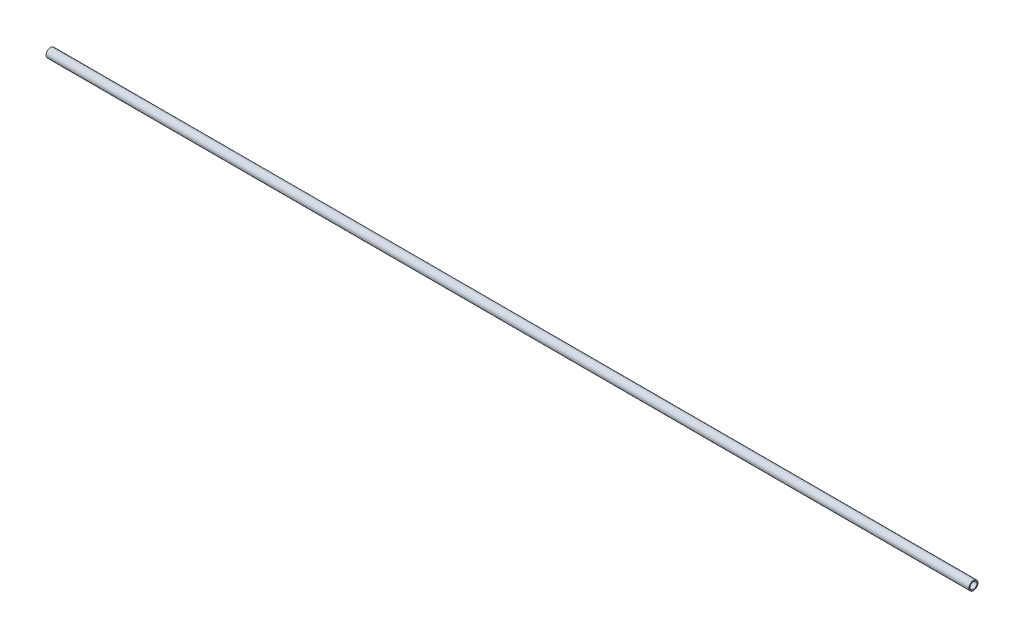
ISO-10303-21;
HEADER;
FILE_DESCRIPTION(('STEP AP214'),'2;1');
FILE_NAME('part.step','',(''),(''),'','','');
FILE_SCHEMA(('AUTOMOTIVE_DESIGN { 1 0 10303 214 1 1 1 1 }'));
ENDSEC;
DATA;
#1=APPLICATION_CONTEXT('core data for automotive mechanical design processes');
#2=APPLICATION_PROTOCOL_DEFINITION('international standard','automotive_design',2000,#1);
#3=PRODUCT_CONTEXT('',#1,'mechanical');
#4=PRODUCT('Part','Part','',(#3));
#5=PRODUCT_RELATED_PRODUCT_CATEGORY('part','',(#4));
#6=PRODUCT_DEFINITION_FORMATION('','',#4);
#7=PRODUCT_DEFINITION_CONTEXT('part definition',#1,'design');
#8=PRODUCT_DEFINITION('design','',#6,#7);
#9=PRODUCT_DEFINITION_SHAPE('','',#8);
#10=(LENGTH_UNIT() NAMED_UNIT(*) SI_UNIT(.MILLI.,.METRE.));
#11=(NAMED_UNIT(*) PLANE_ANGLE_UNIT() SI_UNIT($,.RADIAN.));
#12=(NAMED_UNIT(*) SI_UNIT($,.STERADIAN.) SOLID_ANGLE_UNIT());
#13=UNCERTAINTY_MEASURE_WITH_UNIT(LENGTH_MEASURE(1.E-05),#10,'distance_accuracy_value','');
#14=(GEOMETRIC_REPRESENTATION_CONTEXT(3) GLOBAL_UNCERTAINTY_ASSIGNED_CONTEXT((#13)) GLOBAL_UNIT_ASSIGNED_CONTEXT((#10,
#11,#12)) REPRESENTATION_CONTEXT('',''));
#15=CARTESIAN_POINT('',(0.,0.,0.));
#16=DIRECTION('',(0.,0.,1.));
#17=DIRECTION('',(1.,0.,0.));
#18=AXIS2_PLACEMENT_3D('',#15,#16,#17);
#19=CARTESIAN_POINT('',(2606.04,0.,0.));
#20=DIRECTION('',(1.,0.,0.));
#21=DIRECTION('',(0.,0.,-1.));
#22=AXIS2_PLACEMENT_3D('',#19,#20,#21);
#23=PLANE('',#22);
#24=CARTESIAN_POINT('',(2606.04,0.,0.));
#25=DIRECTION('',(1.,0.,0.));
#26=DIRECTION('',(0.,0.,-1.));
#27=AXIS2_PLACEMENT_3D('',#24,#25,#26);
#28=CIRCLE('',#27,12.7);
#29=CARTESIAN_POINT('',(2606.04,0.,-12.7));
#30=VERTEX_POINT('',#29);
#31=EDGE_CURVE('E10',#30,#30,#28,.T.);
#32=ORIENTED_EDGE('',*,*,#31,.T.);
#33=EDGE_LOOP('',(#32));
#34=FACE_BOUND('',#33,.T.);
#35=CARTESIAN_POINT('',(2606.04,0.,0.));
#36=DIRECTION('',(1.,0.,0.));
#37=DIRECTION('',(0.,0.,-1.));
#38=AXIS2_PLACEMENT_3D('',#35,#36,#37);
#39=CIRCLE('',#38,9.652);
#40=CARTESIAN_POINT('',(2606.04,0.,-9.652));
#41=VERTEX_POINT('',#40);
#42=EDGE_CURVE('E41',#41,#41,#39,.T.);
#43=ORIENTED_EDGE('',*,*,#42,.F.);
#44=EDGE_LOOP('',(#43));
#45=FACE_BOUND('',#44,.T.);
#46=ADVANCED_FACE('F30',(#34,#45),#23,.T.);
#47=CARTESIAN_POINT('',(0.,0.,0.));
#48=DIRECTION('',(1.,0.,0.));
#49=DIRECTION('',(0.,0.,-1.));
#50=AXIS2_PLACEMENT_3D('',#47,#48,#49);
#51=PLANE('',#50);
#52=CARTESIAN_POINT('',(0.,0.,0.));
#53=DIRECTION('',(1.,0.,0.));
#54=DIRECTION('',(0.,0.,-1.));
#55=AXIS2_PLACEMENT_3D('',#52,#53,#54);
#56=CIRCLE('',#55,12.7);
#57=CARTESIAN_POINT('',(0.,0.,-12.7));
#58=VERTEX_POINT('',#57);
#59=EDGE_CURVE('E34',#58,#58,#56,.T.);
#60=ORIENTED_EDGE('',*,*,#59,.F.);
#61=EDGE_LOOP('',(#60));
#62=FACE_BOUND('',#61,.T.);
#63=CARTESIAN_POINT('',(0.,0.,0.));
#64=DIRECTION('',(1.,0.,0.));
#65=DIRECTION('',(0.,0.,-1.));
#66=AXIS2_PLACEMENT_3D('',#63,#64,#65);
#67=CIRCLE('',#66,9.652);
#68=CARTESIAN_POINT('',(0.,0.,-9.652));
#69=VERTEX_POINT('',#68);
#70=EDGE_CURVE('E43',#69,#69,#67,.T.);
#71=ORIENTED_EDGE('',*,*,#70,.T.);
#72=EDGE_LOOP('',(#71));
#73=FACE_BOUND('',#72,.T.);
#74=ADVANCED_FACE('F53',(#62,#73),#51,.F.);
#75=CARTESIAN_POINT('',(2606.04,0.,0.));
#76=DIRECTION('',(-1.,0.,0.));
#77=DIRECTION('',(0.,0.,1.));
#78=AXIS2_PLACEMENT_3D('',#75,#76,#77);
#79=CYLINDRICAL_SURFACE('',#78,12.7);
#80=ORIENTED_EDGE('',*,*,#31,.F.);
#81=EDGE_LOOP('',(#80));
#82=FACE_BOUND('',#81,.T.);
#83=ORIENTED_EDGE('',*,*,#59,.T.);
#84=EDGE_LOOP('',(#83));
#85=FACE_BOUND('',#84,.T.);
#86=ADVANCED_FACE('F32',(#82,#85),#79,.T.);
#87=CARTESIAN_POINT('',(2606.04,0.,0.));
#88=DIRECTION('',(-1.,0.,0.));
#89=DIRECTION('',(0.,0.,1.));
#90=AXIS2_PLACEMENT_3D('',#87,#88,#89);
#91=CYLINDRICAL_SURFACE('',#90,9.652);
#92=ORIENTED_EDGE('',*,*,#42,.T.);
#93=EDGE_LOOP('',(#92));
#94=FACE_BOUND('',#93,.T.);
#95=ORIENTED_EDGE('',*,*,#70,.F.);
#96=EDGE_LOOP('',(#95));
#97=FACE_BOUND('',#96,.T.);
#98=ADVANCED_FACE('F49',(#94,#97),#91,.F.);
#99=CLOSED_SHELL('',(#46,#74,#86,#98));
#100=MANIFOLD_SOLID_BREP('B2',#99);
#101=ADVANCED_BREP_SHAPE_REPRESENTATION('',(#18,#100),#14);
#102=SHAPE_DEFINITION_REPRESENTATION(#9,#101);
ENDSEC;
END-ISO-10303-21;
